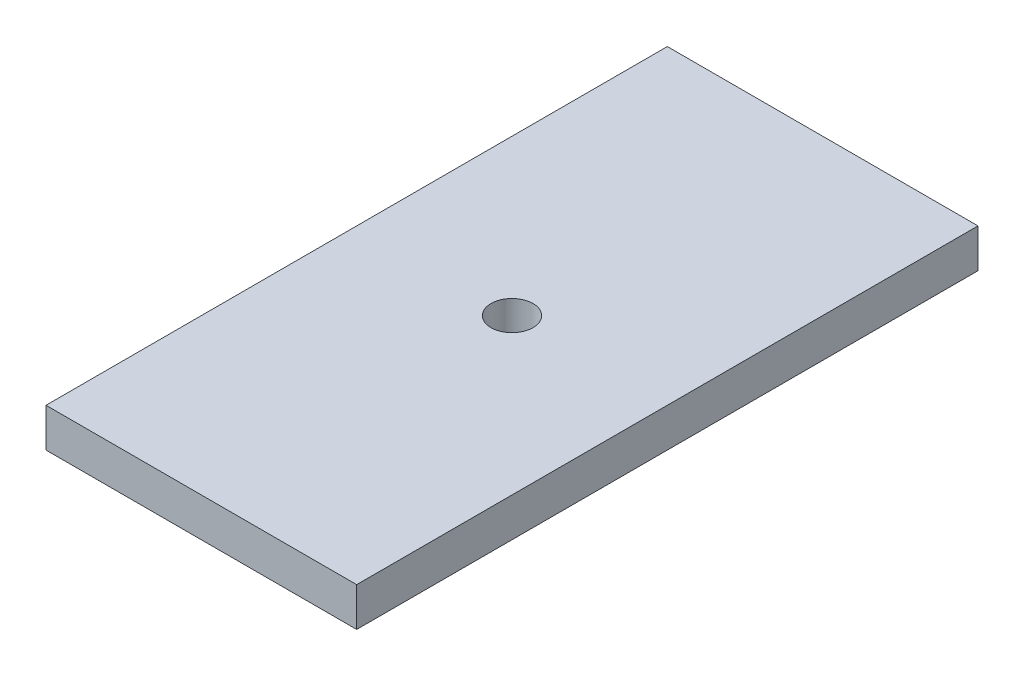
ISO-10303-21;
HEADER;
FILE_DESCRIPTION(('STEP AP214'),'2;1');
FILE_NAME('part.step','',(''),(''),'','','');
FILE_SCHEMA(('AUTOMOTIVE_DESIGN { 1 0 10303 214 1 1 1 1 }'));
ENDSEC;
DATA;
#1=APPLICATION_CONTEXT('core data for automotive mechanical design processes');
#2=APPLICATION_PROTOCOL_DEFINITION('international standard','automotive_design',2000,#1);
#3=PRODUCT_CONTEXT('',#1,'mechanical');
#4=PRODUCT('Part','Part','',(#3));
#5=PRODUCT_RELATED_PRODUCT_CATEGORY('part','',(#4));
#6=PRODUCT_DEFINITION_FORMATION('','',#4);
#7=PRODUCT_DEFINITION_CONTEXT('part definition',#1,'design');
#8=PRODUCT_DEFINITION('design','',#6,#7);
#9=PRODUCT_DEFINITION_SHAPE('','',#8);
#10=(LENGTH_UNIT() NAMED_UNIT(*) SI_UNIT(.MILLI.,.METRE.));
#11=(NAMED_UNIT(*) PLANE_ANGLE_UNIT() SI_UNIT($,.RADIAN.));
#12=(NAMED_UNIT(*) SI_UNIT($,.STERADIAN.) SOLID_ANGLE_UNIT());
#13=UNCERTAINTY_MEASURE_WITH_UNIT(LENGTH_MEASURE(1.E-05),#10,'distance_accuracy_value','');
#14=(GEOMETRIC_REPRESENTATION_CONTEXT(3) GLOBAL_UNCERTAINTY_ASSIGNED_CONTEXT((#13)) GLOBAL_UNIT_ASSIGNED_CONTEXT((#10,
#11,#12)) REPRESENTATION_CONTEXT('',''));
#15=CARTESIAN_POINT('',(0.,0.,0.));
#16=DIRECTION('',(0.,0.,1.));
#17=DIRECTION('',(1.,0.,0.));
#18=AXIS2_PLACEMENT_3D('',#15,#16,#17);
#19=CARTESIAN_POINT('',(0.,6.35,0.));
#20=DIRECTION('',(0.,-1.,0.));
#21=DIRECTION('',(0.,0.,-1.));
#22=AXIS2_PLACEMENT_3D('',#19,#20,#21);
#23=PLANE('',#22);
#24=DIRECTION('',(0.,0.,1.));
#25=VECTOR('',#24,1.);
#26=CARTESIAN_POINT('',(-25.4,6.35,-50.8));
#27=LINE('',#26,#25);
#28=CARTESIAN_POINT('',(-25.4,6.35,-50.8));
#29=VERTEX_POINT('',#28);
#30=CARTESIAN_POINT('',(-25.4,6.35,50.8));
#31=VERTEX_POINT('',#30);
#32=EDGE_CURVE('E86',#29,#31,#27,.T.);
#33=ORIENTED_EDGE('',*,*,#32,.T.);
#34=DIRECTION('',(1.,0.,0.));
#35=VECTOR('',#34,1.);
#36=CARTESIAN_POINT('',(25.4,6.35,50.8));
#37=LINE('',#36,#35);
#38=CARTESIAN_POINT('',(25.4,6.35,50.8));
#39=VERTEX_POINT('',#38);
#40=EDGE_CURVE('E81',#31,#39,#37,.T.);
#41=ORIENTED_EDGE('',*,*,#40,.T.);
#42=DIRECTION('',(0.,0.,-1.));
#43=VECTOR('',#42,1.);
#44=CARTESIAN_POINT('',(25.4,6.35,-50.8));
#45=LINE('',#44,#43);
#46=CARTESIAN_POINT('',(25.4,6.35,-50.8));
#47=VERTEX_POINT('',#46);
#48=EDGE_CURVE('E84',#39,#47,#45,.T.);
#49=ORIENTED_EDGE('',*,*,#48,.T.);
#50=DIRECTION('',(-1.,0.,0.));
#51=VECTOR('',#50,1.);
#52=CARTESIAN_POINT('',(25.4,6.35,-50.8));
#53=LINE('',#52,#51);
#54=EDGE_CURVE('E51',#47,#29,#53,.T.);
#55=ORIENTED_EDGE('',*,*,#54,.T.);
#56=EDGE_LOOP('',(#33,#41,#49,#55));
#57=FACE_BOUND('',#56,.T.);
#58=CARTESIAN_POINT('',(0.,6.35,0.));
#59=DIRECTION('',(0.,1.,0.));
#60=DIRECTION('',(0.,0.,1.));
#61=AXIS2_PLACEMENT_3D('',#58,#59,#60);
#62=CIRCLE('',#61,3.429);
#63=CARTESIAN_POINT('',(0.,6.35,3.42900000000001));
#64=VERTEX_POINT('',#63);
#65=EDGE_CURVE('E101',#64,#64,#62,.T.);
#66=ORIENTED_EDGE('',*,*,#65,.F.);
#67=EDGE_LOOP('',(#66));
#68=FACE_BOUND('',#67,.T.);
#69=ADVANCED_FACE('F34',(#57,#68),#23,.F.);
#70=CARTESIAN_POINT('',(0.,0.,0.));
#71=DIRECTION('',(0.,-1.,0.));
#72=DIRECTION('',(0.,0.,-1.));
#73=AXIS2_PLACEMENT_3D('',#70,#71,#72);
#74=PLANE('',#73);
#75=DIRECTION('',(0.,0.,1.));
#76=VECTOR('',#75,1.);
#77=CARTESIAN_POINT('',(-25.4,0.,-50.8));
#78=LINE('',#77,#76);
#79=CARTESIAN_POINT('',(-25.4,0.,-50.8));
#80=VERTEX_POINT('',#79);
#81=CARTESIAN_POINT('',(-25.4,0.,50.8));
#82=VERTEX_POINT('',#81);
#83=EDGE_CURVE('E98',#80,#82,#78,.T.);
#84=ORIENTED_EDGE('',*,*,#83,.F.);
#85=DIRECTION('',(-1.,0.,0.));
#86=VECTOR('',#85,1.);
#87=CARTESIAN_POINT('',(25.4,0.,-50.8));
#88=LINE('',#87,#86);
#89=CARTESIAN_POINT('',(25.4,0.,-50.8));
#90=VERTEX_POINT('',#89);
#91=EDGE_CURVE('E74',#90,#80,#88,.T.);
#92=ORIENTED_EDGE('',*,*,#91,.F.);
#93=DIRECTION('',(0.,0.,-1.));
#94=VECTOR('',#93,1.);
#95=CARTESIAN_POINT('',(25.4,0.,-50.8));
#96=LINE('',#95,#94);
#97=CARTESIAN_POINT('',(25.4,0.,50.8));
#98=VERTEX_POINT('',#97);
#99=EDGE_CURVE('E68',#98,#90,#96,.T.);
#100=ORIENTED_EDGE('',*,*,#99,.F.);
#101=DIRECTION('',(1.,0.,0.));
#102=VECTOR('',#101,1.);
#103=CARTESIAN_POINT('',(25.4,0.,50.8));
#104=LINE('',#103,#102);
#105=EDGE_CURVE('E90',#82,#98,#104,.T.);
#106=ORIENTED_EDGE('',*,*,#105,.F.);
#107=EDGE_LOOP('',(#84,#92,#100,#106));
#108=FACE_BOUND('',#107,.T.);
#109=CARTESIAN_POINT('',(0.,0.,0.));
#110=DIRECTION('',(0.,1.,0.));
#111=DIRECTION('',(0.,0.,1.));
#112=AXIS2_PLACEMENT_3D('',#109,#110,#111);
#113=CIRCLE('',#112,3.429);
#114=CARTESIAN_POINT('',(0.,0.,3.42900000000001));
#115=VERTEX_POINT('',#114);
#116=EDGE_CURVE('E113',#115,#115,#113,.T.);
#117=ORIENTED_EDGE('',*,*,#116,.T.);
#118=EDGE_LOOP('',(#117));
#119=FACE_BOUND('',#118,.T.);
#120=ADVANCED_FACE('F109',(#108,#119),#74,.T.);
#121=CARTESIAN_POINT('',(-25.4,6.35,-50.8));
#122=DIRECTION('',(1.,0.,0.));
#123=DIRECTION('',(0.,0.,-1.));
#124=AXIS2_PLACEMENT_3D('',#121,#122,#123);
#125=PLANE('',#124);
#126=ORIENTED_EDGE('',*,*,#83,.T.);
#127=DIRECTION('',(0.,-1.,0.));
#128=VECTOR('',#127,1.);
#129=CARTESIAN_POINT('',(-25.4,6.35,50.8));
#130=LINE('',#129,#128);
#131=EDGE_CURVE('E11',#31,#82,#130,.T.);
#132=ORIENTED_EDGE('',*,*,#131,.F.);
#133=ORIENTED_EDGE('',*,*,#32,.F.);
#134=DIRECTION('',(0.,-1.,0.));
#135=VECTOR('',#134,1.);
#136=CARTESIAN_POINT('',(-25.4,6.35,-50.8));
#137=LINE('',#136,#135);
#138=EDGE_CURVE('E94',#29,#80,#137,.T.);
#139=ORIENTED_EDGE('',*,*,#138,.T.);
#140=EDGE_LOOP('',(#126,#132,#133,#139));
#141=FACE_BOUND('',#140,.T.);
#142=ADVANCED_FACE('F36',(#141),#125,.F.);
#143=CARTESIAN_POINT('',(25.4,6.35,50.8));
#144=DIRECTION('',(0.,0.,-1.));
#145=DIRECTION('',(-1.,0.,0.));
#146=AXIS2_PLACEMENT_3D('',#143,#144,#145);
#147=PLANE('',#146);
#148=ORIENTED_EDGE('',*,*,#105,.T.);
#149=DIRECTION('',(0.,-1.,0.));
#150=VECTOR('',#149,1.);
#151=CARTESIAN_POINT('',(25.4,6.35,50.8));
#152=LINE('',#151,#150);
#153=EDGE_CURVE('E43',#39,#98,#152,.T.);
#154=ORIENTED_EDGE('',*,*,#153,.F.);
#155=ORIENTED_EDGE('',*,*,#40,.F.);
#156=ORIENTED_EDGE('',*,*,#131,.T.);
#157=EDGE_LOOP('',(#148,#154,#155,#156));
#158=FACE_BOUND('',#157,.T.);
#159=ADVANCED_FACE('F89',(#158),#147,.F.);
#160=CARTESIAN_POINT('',(25.4,6.35,-50.8));
#161=DIRECTION('',(-1.,0.,0.));
#162=DIRECTION('',(0.,0.,1.));
#163=AXIS2_PLACEMENT_3D('',#160,#161,#162);
#164=PLANE('',#163);
#165=ORIENTED_EDGE('',*,*,#99,.T.);
#166=DIRECTION('',(0.,-1.,0.));
#167=VECTOR('',#166,1.);
#168=CARTESIAN_POINT('',(25.4,6.35,-50.8));
#169=LINE('',#168,#167);
#170=EDGE_CURVE('E91',#47,#90,#169,.T.);
#171=ORIENTED_EDGE('',*,*,#170,.F.);
#172=ORIENTED_EDGE('',*,*,#48,.F.);
#173=ORIENTED_EDGE('',*,*,#153,.T.);
#174=EDGE_LOOP('',(#165,#171,#172,#173));
#175=FACE_BOUND('',#174,.T.);
#176=ADVANCED_FACE('F92',(#175),#164,.F.);
#177=CARTESIAN_POINT('',(25.4,6.35,-50.8));
#178=DIRECTION('',(0.,0.,1.));
#179=DIRECTION('',(1.,0.,0.));
#180=AXIS2_PLACEMENT_3D('',#177,#178,#179);
#181=PLANE('',#180);
#182=ORIENTED_EDGE('',*,*,#91,.T.);
#183=ORIENTED_EDGE('',*,*,#138,.F.);
#184=ORIENTED_EDGE('',*,*,#54,.F.);
#185=ORIENTED_EDGE('',*,*,#170,.T.);
#186=EDGE_LOOP('',(#182,#183,#184,#185));
#187=FACE_BOUND('',#186,.T.);
#188=ADVANCED_FACE('F106',(#187),#181,.F.);
#189=CARTESIAN_POINT('',(0.,6.35,0.));
#190=DIRECTION('',(0.,-1.,0.));
#191=DIRECTION('',(0.,0.,-1.));
#192=AXIS2_PLACEMENT_3D('',#189,#190,#191);
#193=CYLINDRICAL_SURFACE('',#192,3.429);
#194=ORIENTED_EDGE('',*,*,#65,.T.);
#195=EDGE_LOOP('',(#194));
#196=FACE_BOUND('',#195,.T.);
#197=ORIENTED_EDGE('',*,*,#116,.F.);
#198=EDGE_LOOP('',(#197));
#199=FACE_BOUND('',#198,.T.);
#200=ADVANCED_FACE('F119',(#196,#199),#193,.F.);
#201=CLOSED_SHELL('',(#69,#120,#142,#159,#176,#188,#200));
#202=MANIFOLD_SOLID_BREP('B2',#201);
#203=ADVANCED_BREP_SHAPE_REPRESENTATION('',(#18,#202),#14);
#204=SHAPE_DEFINITION_REPRESENTATION(#9,#203);
ENDSEC;
END-ISO-10303-21;
